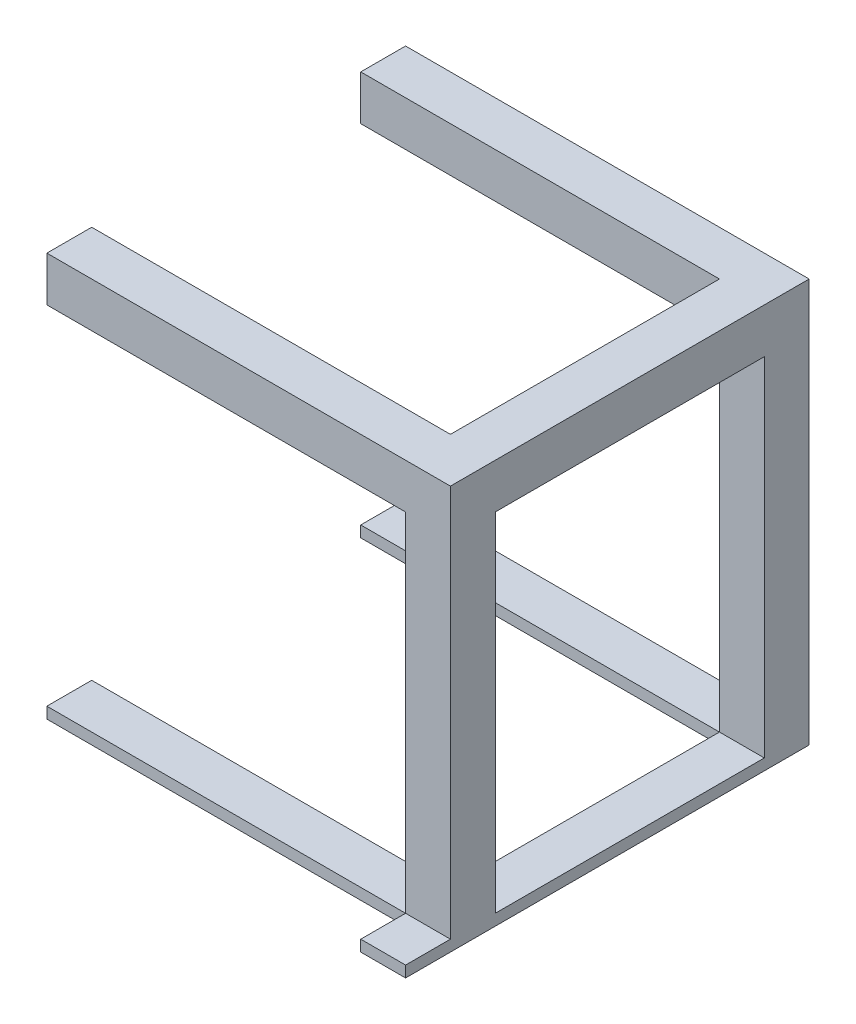
ISO-10303-21;
HEADER;
FILE_DESCRIPTION(('STEP AP214'),'2;1');
FILE_NAME('part.step','',(''),(''),'','','');
FILE_SCHEMA(('AUTOMOTIVE_DESIGN { 1 0 10303 214 1 1 1 1 }'));
ENDSEC;
DATA;
#1=APPLICATION_CONTEXT('core data for automotive mechanical design processes');
#2=APPLICATION_PROTOCOL_DEFINITION('international standard','automotive_design',2000,#1);
#3=PRODUCT_CONTEXT('',#1,'mechanical');
#4=PRODUCT('Part','Part','',(#3));
#5=PRODUCT_RELATED_PRODUCT_CATEGORY('part','',(#4));
#6=PRODUCT_DEFINITION_FORMATION('','',#4);
#7=PRODUCT_DEFINITION_CONTEXT('part definition',#1,'design');
#8=PRODUCT_DEFINITION('design','',#6,#7);
#9=PRODUCT_DEFINITION_SHAPE('','',#8);
#10=(LENGTH_UNIT() NAMED_UNIT(*) SI_UNIT(.MILLI.,.METRE.));
#11=(NAMED_UNIT(*) PLANE_ANGLE_UNIT() SI_UNIT($,.RADIAN.));
#12=(NAMED_UNIT(*) SI_UNIT($,.STERADIAN.) SOLID_ANGLE_UNIT());
#13=UNCERTAINTY_MEASURE_WITH_UNIT(LENGTH_MEASURE(1.E-05),#10,'distance_accuracy_value','');
#14=(GEOMETRIC_REPRESENTATION_CONTEXT(3) GLOBAL_UNCERTAINTY_ASSIGNED_CONTEXT((#13)) GLOBAL_UNIT_ASSIGNED_CONTEXT((#10,
#11,#12)) REPRESENTATION_CONTEXT('',''));
#15=CARTESIAN_POINT('',(0.,0.,0.));
#16=DIRECTION('',(0.,0.,1.));
#17=DIRECTION('',(1.,0.,0.));
#18=AXIS2_PLACEMENT_3D('',#15,#16,#17);
#19=CARTESIAN_POINT('',(627.350505616985,973.83218448899,1380.97382002432));
#20=DIRECTION('',(1.,0.,0.));
#21=DIRECTION('',(0.,1.,0.));
#22=AXIS2_PLACEMENT_3D('',#19,#20,#21);
#23=PLANE('',#22);
#24=DIRECTION('',(0.,0.,-1.));
#25=VECTOR('',#24,1.);
#26=CARTESIAN_POINT('',(627.350505616985,751.58218448899,1279.37382002432));
#27=LINE('',#26,#25);
#28=CARTESIAN_POINT('',(627.350505616985,751.58218448899,1380.97382002432));
#29=VERTEX_POINT('',#28);
#30=CARTESIAN_POINT('',(627.350505616985,751.58218448899,1355.57382002432));
#31=VERTEX_POINT('',#30);
#32=EDGE_CURVE('E46',#29,#31,#27,.T.);
#33=ORIENTED_EDGE('',*,*,#32,.T.);
#34=DIRECTION('',(0.,-1.,0.));
#35=VECTOR('',#34,1.);
#36=CARTESIAN_POINT('',(627.350505616985,751.58218448899,1355.57382002432));
#37=LINE('',#36,#35);
#38=CARTESIAN_POINT('',(627.350505616985,745.23218448899,1355.57382002432));
#39=VERTEX_POINT('',#38);
#40=EDGE_CURVE('E348',#31,#39,#37,.T.);
#41=ORIENTED_EDGE('',*,*,#40,.T.);
#42=DIRECTION('',(0.,0.,-1.));
#43=VECTOR('',#42,1.);
#44=CARTESIAN_POINT('',(627.350505616985,745.23218448899,1279.37382002432));
#45=LINE('',#44,#43);
#46=CARTESIAN_POINT('',(627.350505616985,745.23218448899,1380.97382002432));
#47=VERTEX_POINT('',#46);
#48=EDGE_CURVE('E346',#47,#39,#45,.T.);
#49=ORIENTED_EDGE('',*,*,#48,.F.);
#50=DIRECTION('',(0.,-1.,0.));
#51=VECTOR('',#50,1.);
#52=CARTESIAN_POINT('',(627.350505616985,751.58218448899,1380.97382002432));
#53=LINE('',#52,#51);
#54=EDGE_CURVE('E340',#29,#47,#53,.T.);
#55=ORIENTED_EDGE('',*,*,#54,.F.);
#56=EDGE_LOOP('',(#33,#41,#49,#55));
#57=FACE_BOUND('',#56,.T.);
#58=ADVANCED_FACE('F43',(#57),#23,.F.);
#59=DIRECTION('',(0.,-1.,0.));
#60=VECTOR('',#59,1.);
#61=CARTESIAN_POINT('',(627.350505616985,751.58218448899,1203.17382002432));
#62=LINE('',#61,#60);
#63=CARTESIAN_POINT('',(627.350505616985,751.58218448899,1203.17382002432));
#64=VERTEX_POINT('',#63);
#65=CARTESIAN_POINT('',(627.350505616985,745.23218448899,1203.17382002432));
#66=VERTEX_POINT('',#65);
#67=EDGE_CURVE('E335',#64,#66,#62,.T.);
#68=ORIENTED_EDGE('',*,*,#67,.F.);
#69=DIRECTION('',(0.,0.,-1.));
#70=VECTOR('',#69,1.);
#71=CARTESIAN_POINT('',(627.350505616985,751.58218448899,1279.37382002432));
#72=LINE('',#71,#70);
#73=CARTESIAN_POINT('',(627.350505616985,751.58218448899,1177.77382002432));
#74=VERTEX_POINT('',#73);
#75=EDGE_CURVE('E51',#64,#74,#72,.T.);
#76=ORIENTED_EDGE('',*,*,#75,.T.);
#77=DIRECTION('',(0.,-1.,0.));
#78=VECTOR('',#77,1.);
#79=CARTESIAN_POINT('',(627.350505616985,973.83218448899,1177.77382002432));
#80=LINE('',#79,#78);
#81=CARTESIAN_POINT('',(627.350505616985,745.23218448899,1177.77382002432));
#82=VERTEX_POINT('',#81);
#83=EDGE_CURVE('E336',#74,#82,#80,.T.);
#84=ORIENTED_EDGE('',*,*,#83,.T.);
#85=EDGE_CURVE('E345',#66,#82,#45,.T.);
#86=ORIENTED_EDGE('',*,*,#85,.F.);
#87=EDGE_LOOP('',(#68,#76,#84,#86));
#88=FACE_BOUND('',#87,.T.);
#89=ADVANCED_FACE('F434',(#88),#23,.F.);
#90=DIRECTION('',(0.,0.,-1.));
#91=VECTOR('',#90,1.);
#92=CARTESIAN_POINT('',(627.350505616985,973.83218448899,1279.37382002432));
#93=LINE('',#92,#91);
#94=CARTESIAN_POINT('',(627.350505616985,973.83218448899,1203.17382002432));
#95=VERTEX_POINT('',#94);
#96=CARTESIAN_POINT('',(627.350505616985,973.83218448899,1177.77382002432));
#97=VERTEX_POINT('',#96);
#98=EDGE_CURVE('E190',#95,#97,#93,.T.);
#99=ORIENTED_EDGE('',*,*,#98,.T.);
#100=CARTESIAN_POINT('',(627.350505616985,948.43218448899,1177.77382002432));
#101=VERTEX_POINT('',#100);
#102=EDGE_CURVE('E329',#97,#101,#80,.T.);
#103=ORIENTED_EDGE('',*,*,#102,.T.);
#104=DIRECTION('',(0.,0.,-1.));
#105=VECTOR('',#104,1.);
#106=CARTESIAN_POINT('',(627.350505616985,948.43218448899,1279.37382002432));
#107=LINE('',#106,#105);
#108=CARTESIAN_POINT('',(627.350505616985,948.43218448899,1203.17382002432));
#109=VERTEX_POINT('',#108);
#110=EDGE_CURVE('E327',#109,#101,#107,.T.);
#111=ORIENTED_EDGE('',*,*,#110,.F.);
#112=DIRECTION('',(0.,-1.,0.));
#113=VECTOR('',#112,1.);
#114=CARTESIAN_POINT('',(627.350505616985,973.83218448899,1203.17382002432));
#115=LINE('',#114,#113);
#116=EDGE_CURVE('E332',#95,#109,#115,.T.);
#117=ORIENTED_EDGE('',*,*,#116,.F.);
#118=EDGE_LOOP('',(#99,#103,#111,#117));
#119=FACE_BOUND('',#118,.T.);
#120=ADVANCED_FACE('F439',(#119),#23,.F.);
#121=DIRECTION('',(0.,1.,0.));
#122=VECTOR('',#121,1.);
#123=CARTESIAN_POINT('',(627.350505616985,973.83218448899,1380.97382002432));
#124=LINE('',#123,#122);
#125=CARTESIAN_POINT('',(627.350505616985,948.43218448899,1380.97382002432));
#126=VERTEX_POINT('',#125);
#127=CARTESIAN_POINT('',(627.350505616985,973.83218448899,1380.97382002432));
#128=VERTEX_POINT('',#127);
#129=EDGE_CURVE('E11',#126,#128,#124,.T.);
#130=ORIENTED_EDGE('',*,*,#129,.T.);
#131=CARTESIAN_POINT('',(627.350505616985,973.83218448899,1355.57382002432));
#132=VERTEX_POINT('',#131);
#133=EDGE_CURVE('E66',#128,#132,#93,.T.);
#134=ORIENTED_EDGE('',*,*,#133,.T.);
#135=DIRECTION('',(0.,1.,0.));
#136=VECTOR('',#135,1.);
#137=CARTESIAN_POINT('',(627.350505616985,973.83218448899,1355.57382002432));
#138=LINE('',#137,#136);
#139=CARTESIAN_POINT('',(627.350505616985,948.43218448899,1355.57382002432));
#140=VERTEX_POINT('',#139);
#141=EDGE_CURVE('E330',#140,#132,#138,.T.);
#142=ORIENTED_EDGE('',*,*,#141,.F.);
#143=DIRECTION('',(0.,0.,-1.));
#144=VECTOR('',#143,1.);
#145=CARTESIAN_POINT('',(627.350505616985,948.43218448899,1279.37382002432));
#146=LINE('',#145,#144);
#147=EDGE_CURVE('E58',#126,#140,#146,.T.);
#148=ORIENTED_EDGE('',*,*,#147,.F.);
#149=EDGE_LOOP('',(#130,#134,#142,#148));
#150=FACE_BOUND('',#149,.T.);
#151=ADVANCED_FACE('F435',(#150),#23,.F.);
#152=CARTESIAN_POINT('',(627.350505616985,948.43218448899,1279.37382002432));
#153=DIRECTION('',(0.,1.,0.));
#154=DIRECTION('',(0.,0.,1.));
#155=AXIS2_PLACEMENT_3D('',#152,#153,#154);
#156=PLANE('',#155);
#157=DIRECTION('',(1.,0.,0.));
#158=VECTOR('',#157,1.);
#159=CARTESIAN_POINT('',(627.350505616985,948.43218448899,1380.97382002432));
#160=LINE('',#159,#158);
#161=CARTESIAN_POINT('',(830.550505616985,948.43218448899,1380.97382002432));
#162=VERTEX_POINT('',#161);
#163=EDGE_CURVE('E222',#126,#162,#160,.T.);
#164=ORIENTED_EDGE('',*,*,#163,.F.);
#165=ORIENTED_EDGE('',*,*,#147,.T.);
#166=DIRECTION('',(1.,0.,0.));
#167=VECTOR('',#166,1.);
#168=CARTESIAN_POINT('',(627.350505616985,948.43218448899,1355.57382002432));
#169=LINE('',#168,#167);
#170=CARTESIAN_POINT('',(830.550505616985,948.43218448899,1355.57382002432));
#171=VERTEX_POINT('',#170);
#172=EDGE_CURVE('E219',#140,#171,#169,.T.);
#173=ORIENTED_EDGE('',*,*,#172,.T.);
#174=DIRECTION('',(0.,0.,1.));
#175=VECTOR('',#174,1.);
#176=CARTESIAN_POINT('',(830.550505616985,948.43218448899,1279.37382002432));
#177=LINE('',#176,#175);
#178=EDGE_CURVE('E216',#171,#162,#177,.T.);
#179=ORIENTED_EDGE('',*,*,#178,.T.);
#180=EDGE_LOOP('',(#164,#165,#173,#179));
#181=FACE_BOUND('',#180,.T.);
#182=ADVANCED_FACE('F442',(#181),#156,.F.);
#183=CARTESIAN_POINT('',(627.350505616985,973.83218448899,1380.97382002432));
#184=DIRECTION('',(0.,0.,-1.));
#185=DIRECTION('',(-1.,0.,0.));
#186=AXIS2_PLACEMENT_3D('',#183,#184,#185);
#187=PLANE('',#186);
#188=ORIENTED_EDGE('',*,*,#129,.F.);
#189=ORIENTED_EDGE('',*,*,#163,.T.);
#190=DIRECTION('',(0.,-1.,0.));
#191=VECTOR('',#190,1.);
#192=CARTESIAN_POINT('',(830.550505616985,973.83218448899,1380.97382002432));
#193=LINE('',#192,#191);
#194=CARTESIAN_POINT('',(830.550505616985,751.58218448899,1380.97382002432));
#195=VERTEX_POINT('',#194);
#196=EDGE_CURVE('E263',#162,#195,#193,.T.);
#197=ORIENTED_EDGE('',*,*,#196,.T.);
#198=DIRECTION('',(-1.,0.,0.));
#199=VECTOR('',#198,1.);
#200=CARTESIAN_POINT('',(627.350505616985,751.58218448899,1380.97382002432));
#201=LINE('',#200,#199);
#202=CARTESIAN_POINT('',(855.950505616985,751.58218448899,1380.97382002432));
#203=VERTEX_POINT('',#202);
#204=EDGE_CURVE('E269',#203,#195,#201,.T.);
#205=ORIENTED_EDGE('',*,*,#204,.F.);
#206=DIRECTION('',(0.,-1.,0.));
#207=VECTOR('',#206,1.);
#208=CARTESIAN_POINT('',(855.950505616985,973.83218448899,1380.97382002432));
#209=LINE('',#208,#207);
#210=CARTESIAN_POINT('',(855.950505616985,973.83218448899,1380.97382002432));
#211=VERTEX_POINT('',#210);
#212=EDGE_CURVE('E260',#211,#203,#209,.T.);
#213=ORIENTED_EDGE('',*,*,#212,.F.);
#214=DIRECTION('',(1.,0.,0.));
#215=VECTOR('',#214,1.);
#216=CARTESIAN_POINT('',(627.350505616985,973.83218448899,1380.97382002432));
#217=LINE('',#216,#215);
#218=EDGE_CURVE('E280',#128,#211,#217,.T.);
#219=ORIENTED_EDGE('',*,*,#218,.F.);
#220=EDGE_LOOP('',(#188,#189,#197,#205,#213,#219));
#221=FACE_BOUND('',#220,.T.);
#222=ADVANCED_FACE('F448',(#221),#187,.F.);
#223=CARTESIAN_POINT('',(627.350505616985,973.83218448899,1355.57382002432));
#224=DIRECTION('',(0.,0.,1.));
#225=DIRECTION('',(1.,0.,0.));
#226=AXIS2_PLACEMENT_3D('',#223,#224,#225);
#227=PLANE('',#226);
#228=DIRECTION('',(1.,0.,0.));
#229=VECTOR('',#228,1.);
#230=CARTESIAN_POINT('',(627.350505616985,948.43218448899,1355.57382002432));
#231=LINE('',#230,#229);
#232=CARTESIAN_POINT('',(855.950505616985,948.43218448899,1355.57382002432));
#233=VERTEX_POINT('',#232);
#234=EDGE_CURVE('E209',#171,#233,#231,.T.);
#235=ORIENTED_EDGE('',*,*,#234,.T.);
#236=DIRECTION('',(0.,-1.,0.));
#237=VECTOR('',#236,1.);
#238=CARTESIAN_POINT('',(855.950505616985,973.83218448899,1355.57382002432));
#239=LINE('',#238,#237);
#240=CARTESIAN_POINT('',(855.950505616985,751.58218448899,1355.57382002432));
#241=VERTEX_POINT('',#240);
#242=EDGE_CURVE('E258',#233,#241,#239,.T.);
#243=ORIENTED_EDGE('',*,*,#242,.T.);
#244=DIRECTION('',(-1.,0.,0.));
#245=VECTOR('',#244,1.);
#246=CARTESIAN_POINT('',(627.350505616985,751.58218448899,1355.57382002432));
#247=LINE('',#246,#245);
#248=CARTESIAN_POINT('',(830.550505616985,751.58218448899,1355.57382002432));
#249=VERTEX_POINT('',#248);
#250=EDGE_CURVE('E275',#241,#249,#247,.T.);
#251=ORIENTED_EDGE('',*,*,#250,.T.);
#252=DIRECTION('',(0.,-1.,0.));
#253=VECTOR('',#252,1.);
#254=CARTESIAN_POINT('',(830.550505616985,973.83218448899,1355.57382002432));
#255=LINE('',#254,#253);
#256=EDGE_CURVE('E266',#171,#249,#255,.T.);
#257=ORIENTED_EDGE('',*,*,#256,.F.);
#258=EDGE_LOOP('',(#235,#243,#251,#257));
#259=FACE_BOUND('',#258,.T.);
#260=ADVANCED_FACE('F392',(#259),#227,.F.);
#261=CARTESIAN_POINT('',(627.350505616985,973.83218448899,1203.17382002432));
#262=DIRECTION('',(0.,0.,-1.));
#263=DIRECTION('',(-1.,0.,0.));
#264=AXIS2_PLACEMENT_3D('',#261,#262,#263);
#265=PLANE('',#264);
#266=DIRECTION('',(1.,0.,0.));
#267=VECTOR('',#266,1.);
#268=CARTESIAN_POINT('',(627.350505616985,948.43218448899,1203.17382002432));
#269=LINE('',#268,#267);
#270=CARTESIAN_POINT('',(830.550505616985,948.43218448899,1203.17382002432));
#271=VERTEX_POINT('',#270);
#272=CARTESIAN_POINT('',(855.950505616985,948.43218448899,1203.17382002432));
#273=VERTEX_POINT('',#272);
#274=EDGE_CURVE('E406',#271,#273,#269,.T.);
#275=ORIENTED_EDGE('',*,*,#274,.F.);
#276=DIRECTION('',(0.,-1.,0.));
#277=VECTOR('',#276,1.);
#278=CARTESIAN_POINT('',(830.550505616985,973.83218448899,1203.17382002432));
#279=LINE('',#278,#277);
#280=CARTESIAN_POINT('',(830.550505616985,751.58218448899,1203.17382002432));
#281=VERTEX_POINT('',#280);
#282=EDGE_CURVE('E249',#271,#281,#279,.T.);
#283=ORIENTED_EDGE('',*,*,#282,.T.);
#284=DIRECTION('',(1.,0.,0.));
#285=VECTOR('',#284,1.);
#286=CARTESIAN_POINT('',(627.350505616985,751.58218448899,1203.17382002432));
#287=LINE('',#286,#285);
#288=CARTESIAN_POINT('',(855.950505616985,751.58218448899,1203.17382002432));
#289=VERTEX_POINT('',#288);
#290=EDGE_CURVE('E295',#281,#289,#287,.T.);
#291=ORIENTED_EDGE('',*,*,#290,.T.);
#292=DIRECTION('',(0.,-1.,0.));
#293=VECTOR('',#292,1.);
#294=CARTESIAN_POINT('',(855.950505616985,973.83218448899,1203.17382002432));
#295=LINE('',#294,#293);
#296=EDGE_CURVE('E247',#273,#289,#295,.T.);
#297=ORIENTED_EDGE('',*,*,#296,.F.);
#298=EDGE_LOOP('',(#275,#283,#291,#297));
#299=FACE_BOUND('',#298,.T.);
#300=ADVANCED_FACE('F404',(#299),#265,.F.);
#301=ORIENTED_EDGE('',*,*,#172,.F.);
#302=ORIENTED_EDGE('',*,*,#141,.T.);
#303=DIRECTION('',(-1.,0.,0.));
#304=VECTOR('',#303,1.);
#305=CARTESIAN_POINT('',(627.350505616985,973.83218448899,1355.57382002432));
#306=LINE('',#305,#304);
#307=CARTESIAN_POINT('',(830.550505616985,973.83218448899,1355.57382002432));
#308=VERTEX_POINT('',#307);
#309=EDGE_CURVE('E278',#308,#132,#306,.T.);
#310=ORIENTED_EDGE('',*,*,#309,.F.);
#311=DIRECTION('',(0.,-1.,0.));
#312=VECTOR('',#311,1.);
#313=CARTESIAN_POINT('',(830.550505616985,973.83218448899,1355.57382002432));
#314=LINE('',#313,#312);
#315=EDGE_CURVE('E203',#308,#171,#314,.T.);
#316=ORIENTED_EDGE('',*,*,#315,.T.);
#317=EDGE_LOOP('',(#301,#302,#310,#316));
#318=FACE_BOUND('',#317,.T.);
#319=ADVANCED_FACE('F471',(#318),#227,.F.);
#320=DIRECTION('',(1.,0.,0.));
#321=VECTOR('',#320,1.);
#322=CARTESIAN_POINT('',(627.350505616985,973.83218448899,1203.17382002432));
#323=LINE('',#322,#321);
#324=CARTESIAN_POINT('',(830.550505616985,973.83218448899,1203.17382002432));
#325=VERTEX_POINT('',#324);
#326=EDGE_CURVE('E183',#95,#325,#323,.T.);
#327=ORIENTED_EDGE('',*,*,#326,.F.);
#328=ORIENTED_EDGE('',*,*,#116,.T.);
#329=DIRECTION('',(1.,0.,0.));
#330=VECTOR('',#329,1.);
#331=CARTESIAN_POINT('',(627.350505616985,948.43218448899,1203.17382002432));
#332=LINE('',#331,#330);
#333=EDGE_CURVE('E208',#109,#271,#332,.T.);
#334=ORIENTED_EDGE('',*,*,#333,.T.);
#335=DIRECTION('',(0.,-1.,0.));
#336=VECTOR('',#335,1.);
#337=CARTESIAN_POINT('',(830.550505616985,973.83218448899,1203.17382002432));
#338=LINE('',#337,#336);
#339=EDGE_CURVE('E200',#325,#271,#338,.T.);
#340=ORIENTED_EDGE('',*,*,#339,.F.);
#341=EDGE_LOOP('',(#327,#328,#334,#340));
#342=FACE_BOUND('',#341,.T.);
#343=ADVANCED_FACE('F206',(#342),#265,.F.);
#344=CARTESIAN_POINT('',(830.550505616985,973.83218448899,1279.37382002432));
#345=DIRECTION('',(1.,0.,0.));
#346=DIRECTION('',(0.,0.,-1.));
#347=AXIS2_PLACEMENT_3D('',#344,#345,#346);
#348=PLANE('',#347);
#349=ORIENTED_EDGE('',*,*,#178,.F.);
#350=ORIENTED_EDGE('',*,*,#256,.T.);
#351=DIRECTION('',(0.,0.,-1.));
#352=VECTOR('',#351,1.);
#353=CARTESIAN_POINT('',(830.550505616985,751.58218448899,1279.37382002432));
#354=LINE('',#353,#352);
#355=EDGE_CURVE('E272',#195,#249,#354,.T.);
#356=ORIENTED_EDGE('',*,*,#355,.F.);
#357=ORIENTED_EDGE('',*,*,#196,.F.);
#358=EDGE_LOOP('',(#349,#350,#356,#357));
#359=FACE_BOUND('',#358,.T.);
#360=ADVANCED_FACE('F374',(#359),#348,.F.);
#361=CARTESIAN_POINT('',(830.550505616985,751.58218448899,1279.37382002432));
#362=DIRECTION('',(-1.,0.,0.));
#363=DIRECTION('',(0.,0.,1.));
#364=AXIS2_PLACEMENT_3D('',#361,#362,#363);
#365=PLANE('',#364);
#366=ORIENTED_EDGE('',*,*,#282,.F.);
#367=DIRECTION('',(0.,0.,1.));
#368=VECTOR('',#367,1.);
#369=CARTESIAN_POINT('',(830.550505616985,948.43218448899,1279.37382002432));
#370=LINE('',#369,#368);
#371=CARTESIAN_POINT('',(830.550505616985,948.43218448899,1177.77382002432));
#372=VERTEX_POINT('',#371);
#373=EDGE_CURVE('E224',#372,#271,#370,.T.);
#374=ORIENTED_EDGE('',*,*,#373,.F.);
#375=DIRECTION('',(0.,-1.,0.));
#376=VECTOR('',#375,1.);
#377=CARTESIAN_POINT('',(830.550505616985,973.83218448899,1177.77382002432));
#378=LINE('',#377,#376);
#379=CARTESIAN_POINT('',(830.550505616985,751.58218448899,1177.77382002432));
#380=VERTEX_POINT('',#379);
#381=EDGE_CURVE('E252',#372,#380,#378,.T.);
#382=ORIENTED_EDGE('',*,*,#381,.T.);
#383=DIRECTION('',(0.,0.,1.));
#384=VECTOR('',#383,1.);
#385=CARTESIAN_POINT('',(830.550505616985,751.58218448899,1279.37382002432));
#386=LINE('',#385,#384);
#387=EDGE_CURVE('E231',#380,#281,#386,.T.);
#388=ORIENTED_EDGE('',*,*,#387,.T.);
#389=EDGE_LOOP('',(#366,#374,#382,#388));
#390=FACE_BOUND('',#389,.T.);
#391=ADVANCED_FACE('F410',(#390),#365,.T.);
#392=DIRECTION('',(0.,0.,-1.));
#393=VECTOR('',#392,1.);
#394=CARTESIAN_POINT('',(830.550505616985,751.58218448899,1279.37382002432));
#395=LINE('',#394,#393);
#396=EDGE_CURVE('E298',#249,#281,#395,.T.);
#397=ORIENTED_EDGE('',*,*,#396,.T.);
#398=DIRECTION('',(0.,-1.,0.));
#399=VECTOR('',#398,1.);
#400=CARTESIAN_POINT('',(830.550505616985,751.58218448899,1203.17382002432));
#401=LINE('',#400,#399);
#402=CARTESIAN_POINT('',(830.550505616985,745.23218448899,1203.17382002432));
#403=VERTEX_POINT('',#402);
#404=EDGE_CURVE('E238',#281,#403,#401,.T.);
#405=ORIENTED_EDGE('',*,*,#404,.T.);
#406=DIRECTION('',(0.,0.,-1.));
#407=VECTOR('',#406,1.);
#408=CARTESIAN_POINT('',(830.550505616985,745.23218448899,1279.37382002432));
#409=LINE('',#408,#407);
#410=CARTESIAN_POINT('',(830.550505616985,745.23218448899,1355.57382002432));
#411=VERTEX_POINT('',#410);
#412=EDGE_CURVE('E314',#411,#403,#409,.T.);
#413=ORIENTED_EDGE('',*,*,#412,.F.);
#414=DIRECTION('',(0.,-1.,0.));
#415=VECTOR('',#414,1.);
#416=CARTESIAN_POINT('',(830.550505616985,751.58218448899,1355.57382002432));
#417=LINE('',#416,#415);
#418=EDGE_CURVE('E303',#249,#411,#417,.T.);
#419=ORIENTED_EDGE('',*,*,#418,.F.);
#420=EDGE_LOOP('',(#397,#405,#413,#419));
#421=FACE_BOUND('',#420,.T.);
#422=ADVANCED_FACE('F383',(#421),#365,.T.);
#423=CARTESIAN_POINT('',(627.350505616985,751.58218448899,1279.37382002432));
#424=DIRECTION('',(0.,1.,0.));
#425=DIRECTION('',(0.,0.,1.));
#426=AXIS2_PLACEMENT_3D('',#423,#424,#425);
#427=PLANE('',#426);
#428=ORIENTED_EDGE('',*,*,#32,.F.);
#429=DIRECTION('',(1.,0.,0.));
#430=VECTOR('',#429,1.);
#431=CARTESIAN_POINT('',(627.350505616985,751.58218448899,1380.97382002432));
#432=LINE('',#431,#430);
#433=EDGE_CURVE('E283',#29,#195,#432,.T.);
#434=ORIENTED_EDGE('',*,*,#433,.T.);
#435=ORIENTED_EDGE('',*,*,#355,.T.);
#436=DIRECTION('',(1.,0.,0.));
#437=VECTOR('',#436,1.);
#438=CARTESIAN_POINT('',(627.350505616985,751.58218448899,1355.57382002432));
#439=LINE('',#438,#437);
#440=EDGE_CURVE('E301',#31,#249,#439,.T.);
#441=ORIENTED_EDGE('',*,*,#440,.F.);
#442=EDGE_LOOP('',(#428,#434,#435,#441));
#443=FACE_BOUND('',#442,.T.);
#444=ADVANCED_FACE('F379',(#443),#427,.T.);
#445=DIRECTION('',(0.,0.,-1.));
#446=VECTOR('',#445,1.);
#447=CARTESIAN_POINT('',(855.950505616985,751.58218448899,1279.37382002432));
#448=LINE('',#447,#446);
#449=CARTESIAN_POINT('',(855.950505616985,751.58218448899,1406.37382002432));
#450=VERTEX_POINT('',#449);
#451=EDGE_CURVE('E293',#450,#203,#448,.T.);
#452=ORIENTED_EDGE('',*,*,#451,.T.);
#453=ORIENTED_EDGE('',*,*,#204,.T.);
#454=DIRECTION('',(0.,0.,-1.));
#455=VECTOR('',#454,1.);
#456=CARTESIAN_POINT('',(830.550505616985,751.58218448899,1279.37382002432));
#457=LINE('',#456,#455);
#458=CARTESIAN_POINT('',(830.550505616985,751.58218448899,1406.37382002432));
#459=VERTEX_POINT('',#458);
#460=EDGE_CURVE('E285',#459,#195,#457,.T.);
#461=ORIENTED_EDGE('',*,*,#460,.F.);
#462=DIRECTION('',(-1.,0.,0.));
#463=VECTOR('',#462,1.);
#464=CARTESIAN_POINT('',(627.350505616985,751.58218448899,1406.37382002432));
#465=LINE('',#464,#463);
#466=EDGE_CURVE('E289',#450,#459,#465,.T.);
#467=ORIENTED_EDGE('',*,*,#466,.F.);
#468=EDGE_LOOP('',(#452,#453,#461,#467));
#469=FACE_BOUND('',#468,.T.);
#470=ADVANCED_FACE('F428',(#469),#427,.T.);
#471=CARTESIAN_POINT('',(627.350505616985,751.58218448899,1380.97382002432));
#472=DIRECTION('',(0.,0.,-1.));
#473=DIRECTION('',(-1.,0.,0.));
#474=AXIS2_PLACEMENT_3D('',#471,#472,#473);
#475=PLANE('',#474);
#476=ORIENTED_EDGE('',*,*,#433,.F.);
#477=ORIENTED_EDGE('',*,*,#54,.T.);
#478=DIRECTION('',(1.,0.,0.));
#479=VECTOR('',#478,1.);
#480=CARTESIAN_POINT('',(627.350505616985,745.23218448899,1380.97382002432));
#481=LINE('',#480,#479);
#482=CARTESIAN_POINT('',(830.550505616985,745.23218448899,1380.97382002432));
#483=VERTEX_POINT('',#482);
#484=EDGE_CURVE('E282',#47,#483,#481,.T.);
#485=ORIENTED_EDGE('',*,*,#484,.T.);
#486=DIRECTION('',(0.,-1.,0.));
#487=VECTOR('',#486,1.);
#488=CARTESIAN_POINT('',(830.550505616985,751.58218448899,1380.97382002432));
#489=LINE('',#488,#487);
#490=EDGE_CURVE('E324',#195,#483,#489,.T.);
#491=ORIENTED_EDGE('',*,*,#490,.F.);
#492=EDGE_LOOP('',(#476,#477,#485,#491));
#493=FACE_BOUND('',#492,.T.);
#494=ADVANCED_FACE('F353',(#493),#475,.F.);
#495=CARTESIAN_POINT('',(830.550505616985,751.58218448899,1279.37382002432));
#496=DIRECTION('',(-1.,0.,0.));
#497=DIRECTION('',(0.,0.,1.));
#498=AXIS2_PLACEMENT_3D('',#495,#496,#497);
#499=PLANE('',#498);
#500=DIRECTION('',(0.,0.,-1.));
#501=VECTOR('',#500,1.);
#502=CARTESIAN_POINT('',(830.550505616985,745.23218448899,1279.37382002432));
#503=LINE('',#502,#501);
#504=CARTESIAN_POINT('',(830.550505616985,745.23218448899,1406.37382002432));
#505=VERTEX_POINT('',#504);
#506=EDGE_CURVE('E305',#505,#483,#503,.T.);
#507=ORIENTED_EDGE('',*,*,#506,.F.);
#508=DIRECTION('',(0.,-1.,0.));
#509=VECTOR('',#508,1.);
#510=CARTESIAN_POINT('',(830.550505616985,751.58218448899,1406.37382002432));
#511=LINE('',#510,#509);
#512=EDGE_CURVE('E322',#459,#505,#511,.T.);
#513=ORIENTED_EDGE('',*,*,#512,.F.);
#514=ORIENTED_EDGE('',*,*,#460,.T.);
#515=ORIENTED_EDGE('',*,*,#490,.T.);
#516=EDGE_LOOP('',(#507,#513,#514,#515));
#517=FACE_BOUND('',#516,.T.);
#518=ADVANCED_FACE('F366',(#517),#499,.T.);
#519=CARTESIAN_POINT('',(627.350505616985,751.58218448899,1406.37382002432));
#520=DIRECTION('',(0.,0.,1.));
#521=DIRECTION('',(1.,0.,0.));
#522=AXIS2_PLACEMENT_3D('',#519,#520,#521);
#523=PLANE('',#522);
#524=DIRECTION('',(-1.,0.,0.));
#525=VECTOR('',#524,1.);
#526=CARTESIAN_POINT('',(627.350505616985,745.23218448899,1406.37382002432));
#527=LINE('',#526,#525);
#528=CARTESIAN_POINT('',(855.950505616985,745.23218448899,1406.37382002432));
#529=VERTEX_POINT('',#528);
#530=EDGE_CURVE('E308',#529,#505,#527,.T.);
#531=ORIENTED_EDGE('',*,*,#530,.F.);
#532=DIRECTION('',(0.,-1.,0.));
#533=VECTOR('',#532,1.);
#534=CARTESIAN_POINT('',(855.950505616985,751.58218448899,1406.37382002432));
#535=LINE('',#534,#533);
#536=EDGE_CURVE('E320',#450,#529,#535,.T.);
#537=ORIENTED_EDGE('',*,*,#536,.F.);
#538=ORIENTED_EDGE('',*,*,#466,.T.);
#539=ORIENTED_EDGE('',*,*,#512,.T.);
#540=EDGE_LOOP('',(#531,#537,#538,#539));
#541=FACE_BOUND('',#540,.T.);
#542=ADVANCED_FACE('F429',(#541),#523,.T.);
#543=CARTESIAN_POINT('',(855.950505616985,751.58218448899,1279.37382002432));
#544=DIRECTION('',(-1.,0.,0.));
#545=DIRECTION('',(0.,0.,1.));
#546=AXIS2_PLACEMENT_3D('',#543,#544,#545);
#547=PLANE('',#546);
#548=DIRECTION('',(0.,0.,-1.));
#549=VECTOR('',#548,1.);
#550=CARTESIAN_POINT('',(855.950505616985,948.43218448899,1279.37382002432));
#551=LINE('',#550,#549);
#552=EDGE_CURVE('E400',#233,#273,#551,.T.);
#553=ORIENTED_EDGE('',*,*,#552,.T.);
#554=ORIENTED_EDGE('',*,*,#296,.T.);
#555=EDGE_CURVE('E292',#241,#289,#448,.T.);
#556=ORIENTED_EDGE('',*,*,#555,.F.);
#557=ORIENTED_EDGE('',*,*,#242,.F.);
#558=EDGE_LOOP('',(#553,#554,#556,#557));
#559=FACE_BOUND('',#558,.T.);
#560=DIRECTION('',(0.,-1.,0.));
#561=VECTOR('',#560,1.);
#562=CARTESIAN_POINT('',(855.950505616985,973.83218448899,1177.77382002432));
#563=LINE('',#562,#561);
#564=CARTESIAN_POINT('',(855.950505616985,973.83218448899,1177.77382002432));
#565=VERTEX_POINT('',#564);
#566=CARTESIAN_POINT('',(855.950505616985,745.23218448899,1177.77382002432));
#567=VERTEX_POINT('',#566);
#568=EDGE_CURVE('E193',#565,#567,#563,.T.);
#569=ORIENTED_EDGE('',*,*,#568,.F.);
#570=DIRECTION('',(0.,0.,-1.));
#571=VECTOR('',#570,1.);
#572=CARTESIAN_POINT('',(855.950505616985,973.83218448899,1279.37382002432));
#573=LINE('',#572,#571);
#574=EDGE_CURVE('E255',#211,#565,#573,.T.);
#575=ORIENTED_EDGE('',*,*,#574,.F.);
#576=ORIENTED_EDGE('',*,*,#212,.T.);
#577=ORIENTED_EDGE('',*,*,#451,.F.);
#578=ORIENTED_EDGE('',*,*,#536,.T.);
#579=DIRECTION('',(0.,0.,-1.));
#580=VECTOR('',#579,1.);
#581=CARTESIAN_POINT('',(855.950505616985,745.23218448899,1279.37382002432));
#582=LINE('',#581,#580);
#583=EDGE_CURVE('E311',#529,#567,#582,.T.);
#584=ORIENTED_EDGE('',*,*,#583,.T.);
#585=EDGE_LOOP('',(#569,#575,#576,#577,#578,#584));
#586=FACE_BOUND('',#585,.T.);
#587=ADVANCED_FACE('F397',(#559,#586),#547,.F.);
#588=CARTESIAN_POINT('',(627.350505616985,751.58218448899,1355.57382002432));
#589=DIRECTION('',(0.,0.,-1.));
#590=DIRECTION('',(-1.,0.,0.));
#591=AXIS2_PLACEMENT_3D('',#588,#589,#590);
#592=PLANE('',#591);
#593=ORIENTED_EDGE('',*,*,#40,.F.);
#594=ORIENTED_EDGE('',*,*,#440,.T.);
#595=ORIENTED_EDGE('',*,*,#418,.T.);
#596=DIRECTION('',(1.,0.,0.));
#597=VECTOR('',#596,1.);
#598=CARTESIAN_POINT('',(627.350505616985,745.23218448899,1355.57382002432));
#599=LINE('',#598,#597);
#600=EDGE_CURVE('E286',#39,#411,#599,.T.);
#601=ORIENTED_EDGE('',*,*,#600,.F.);
#602=EDGE_LOOP('',(#593,#594,#595,#601));
#603=FACE_BOUND('',#602,.T.);
#604=ADVANCED_FACE('F420',(#603),#592,.T.);
#605=ORIENTED_EDGE('',*,*,#250,.F.);
#606=ORIENTED_EDGE('',*,*,#555,.T.);
#607=ORIENTED_EDGE('',*,*,#290,.F.);
#608=ORIENTED_EDGE('',*,*,#396,.F.);
#609=EDGE_LOOP('',(#605,#606,#607,#608));
#610=FACE_BOUND('',#609,.T.);
#611=ADVANCED_FACE('F389',(#610),#427,.T.);
#612=CARTESIAN_POINT('',(627.350505616985,745.23218448899,1279.37382002432));
#613=DIRECTION('',(0.,1.,0.));
#614=DIRECTION('',(0.,0.,1.));
#615=AXIS2_PLACEMENT_3D('',#612,#613,#614);
#616=PLANE('',#615);
#617=ORIENTED_EDGE('',*,*,#484,.F.);
#618=ORIENTED_EDGE('',*,*,#48,.T.);
#619=ORIENTED_EDGE('',*,*,#600,.T.);
#620=ORIENTED_EDGE('',*,*,#412,.T.);
#621=DIRECTION('',(1.,0.,0.));
#622=VECTOR('',#621,1.);
#623=CARTESIAN_POINT('',(627.350505616985,745.23218448899,1203.17382002432));
#624=LINE('',#623,#622);
#625=EDGE_CURVE('E230',#66,#403,#624,.T.);
#626=ORIENTED_EDGE('',*,*,#625,.F.);
#627=ORIENTED_EDGE('',*,*,#85,.T.);
#628=DIRECTION('',(1.,0.,0.));
#629=VECTOR('',#628,1.);
#630=CARTESIAN_POINT('',(627.350505616985,745.23218448899,1177.77382002432));
#631=LINE('',#630,#629);
#632=EDGE_CURVE('E242',#82,#567,#631,.T.);
#633=ORIENTED_EDGE('',*,*,#632,.T.);
#634=ORIENTED_EDGE('',*,*,#583,.F.);
#635=ORIENTED_EDGE('',*,*,#530,.T.);
#636=ORIENTED_EDGE('',*,*,#506,.T.);
#637=EDGE_LOOP('',(#617,#618,#619,#620,#626,#627,#633,#634,#635,#636));
#638=FACE_BOUND('',#637,.T.);
#639=ADVANCED_FACE('F361',(#638),#616,.F.);
#640=CARTESIAN_POINT('',(627.350505616985,973.83218448899,1279.37382002432));
#641=DIRECTION('',(0.,1.,0.));
#642=DIRECTION('',(0.,0.,1.));
#643=AXIS2_PLACEMENT_3D('',#640,#641,#642);
#644=PLANE('',#643);
#645=ORIENTED_EDGE('',*,*,#133,.F.);
#646=ORIENTED_EDGE('',*,*,#218,.T.);
#647=ORIENTED_EDGE('',*,*,#574,.T.);
#648=DIRECTION('',(1.,0.,0.));
#649=VECTOR('',#648,1.);
#650=CARTESIAN_POINT('',(627.350505616985,973.83218448899,1177.77382002432));
#651=LINE('',#650,#649);
#652=EDGE_CURVE('E194',#97,#565,#651,.T.);
#653=ORIENTED_EDGE('',*,*,#652,.F.);
#654=ORIENTED_EDGE('',*,*,#98,.F.);
#655=ORIENTED_EDGE('',*,*,#326,.T.);
#656=DIRECTION('',(0.,0.,-1.));
#657=VECTOR('',#656,1.);
#658=CARTESIAN_POINT('',(830.550505616985,973.83218448899,1279.37382002432));
#659=LINE('',#658,#657);
#660=EDGE_CURVE('E186',#308,#325,#659,.T.);
#661=ORIENTED_EDGE('',*,*,#660,.F.);
#662=ORIENTED_EDGE('',*,*,#309,.T.);
#663=EDGE_LOOP('',(#645,#646,#647,#653,#654,#655,#661,#662));
#664=FACE_BOUND('',#663,.T.);
#665=ADVANCED_FACE('F185',(#664),#644,.T.);
#666=CARTESIAN_POINT('',(627.350505616985,973.83218448899,1177.77382002432));
#667=DIRECTION('',(0.,0.,-1.));
#668=DIRECTION('',(-1.,0.,0.));
#669=AXIS2_PLACEMENT_3D('',#666,#667,#668);
#670=PLANE('',#669);
#671=ORIENTED_EDGE('',*,*,#102,.F.);
#672=ORIENTED_EDGE('',*,*,#652,.T.);
#673=ORIENTED_EDGE('',*,*,#568,.T.);
#674=ORIENTED_EDGE('',*,*,#632,.F.);
#675=ORIENTED_EDGE('',*,*,#83,.F.);
#676=DIRECTION('',(1.,0.,0.));
#677=VECTOR('',#676,1.);
#678=CARTESIAN_POINT('',(627.350505616985,751.58218448899,1177.77382002432));
#679=LINE('',#678,#677);
#680=EDGE_CURVE('E234',#74,#380,#679,.T.);
#681=ORIENTED_EDGE('',*,*,#680,.T.);
#682=ORIENTED_EDGE('',*,*,#381,.F.);
#683=DIRECTION('',(1.,0.,0.));
#684=VECTOR('',#683,1.);
#685=CARTESIAN_POINT('',(627.350505616985,948.43218448899,1177.77382002432));
#686=LINE('',#685,#684);
#687=EDGE_CURVE('E227',#101,#372,#686,.T.);
#688=ORIENTED_EDGE('',*,*,#687,.F.);
#689=EDGE_LOOP('',(#671,#672,#673,#674,#675,#681,#682,#688));
#690=FACE_BOUND('',#689,.T.);
#691=ADVANCED_FACE('F468',(#690),#670,.T.);
#692=CARTESIAN_POINT('',(627.350505616985,751.58218448899,1203.17382002432));
#693=DIRECTION('',(0.,0.,-1.));
#694=DIRECTION('',(-1.,0.,0.));
#695=AXIS2_PLACEMENT_3D('',#692,#693,#694);
#696=PLANE('',#695);
#697=DIRECTION('',(1.,0.,0.));
#698=VECTOR('',#697,1.);
#699=CARTESIAN_POINT('',(627.350505616985,751.58218448899,1203.17382002432));
#700=LINE('',#699,#698);
#701=EDGE_CURVE('E236',#64,#281,#700,.T.);
#702=ORIENTED_EDGE('',*,*,#701,.F.);
#703=ORIENTED_EDGE('',*,*,#67,.T.);
#704=ORIENTED_EDGE('',*,*,#625,.T.);
#705=ORIENTED_EDGE('',*,*,#404,.F.);
#706=EDGE_LOOP('',(#702,#703,#704,#705));
#707=FACE_BOUND('',#706,.T.);
#708=ADVANCED_FACE('F418',(#707),#696,.F.);
#709=CARTESIAN_POINT('',(627.350505616985,751.58218448899,1279.37382002432));
#710=DIRECTION('',(0.,1.,0.));
#711=DIRECTION('',(0.,0.,1.));
#712=AXIS2_PLACEMENT_3D('',#709,#710,#711);
#713=PLANE('',#712);
#714=ORIENTED_EDGE('',*,*,#75,.F.);
#715=ORIENTED_EDGE('',*,*,#701,.T.);
#716=ORIENTED_EDGE('',*,*,#387,.F.);
#717=ORIENTED_EDGE('',*,*,#680,.F.);
#718=EDGE_LOOP('',(#714,#715,#716,#717));
#719=FACE_BOUND('',#718,.T.);
#720=ADVANCED_FACE('F414',(#719),#713,.T.);
#721=CARTESIAN_POINT('',(627.350505616985,948.43218448899,1279.37382002432));
#722=DIRECTION('',(0.,1.,0.));
#723=DIRECTION('',(0.,0.,1.));
#724=AXIS2_PLACEMENT_3D('',#721,#722,#723);
#725=PLANE('',#724);
#726=ORIENTED_EDGE('',*,*,#333,.F.);
#727=ORIENTED_EDGE('',*,*,#110,.T.);
#728=ORIENTED_EDGE('',*,*,#687,.T.);
#729=ORIENTED_EDGE('',*,*,#373,.T.);
#730=EDGE_LOOP('',(#726,#727,#728,#729));
#731=FACE_BOUND('',#730,.T.);
#732=ADVANCED_FACE('F458',(#731),#725,.F.);
#733=CARTESIAN_POINT('',(830.550505616985,973.83218448899,1279.37382002432));
#734=DIRECTION('',(-1.,0.,0.));
#735=DIRECTION('',(0.,0.,1.));
#736=AXIS2_PLACEMENT_3D('',#733,#734,#735);
#737=PLANE('',#736);
#738=DIRECTION('',(0.,0.,-1.));
#739=VECTOR('',#738,1.);
#740=CARTESIAN_POINT('',(830.550505616985,948.43218448899,1279.37382002432));
#741=LINE('',#740,#739);
#742=EDGE_CURVE('E220',#171,#271,#741,.T.);
#743=ORIENTED_EDGE('',*,*,#742,.F.);
#744=ORIENTED_EDGE('',*,*,#315,.F.);
#745=ORIENTED_EDGE('',*,*,#660,.T.);
#746=ORIENTED_EDGE('',*,*,#339,.T.);
#747=EDGE_LOOP('',(#743,#744,#745,#746));
#748=FACE_BOUND('',#747,.T.);
#749=ADVANCED_FACE('F199',(#748),#737,.T.);
#750=CARTESIAN_POINT('',(627.350505616985,948.43218448899,1279.37382002432));
#751=DIRECTION('',(0.,1.,0.));
#752=DIRECTION('',(0.,0.,1.));
#753=AXIS2_PLACEMENT_3D('',#750,#751,#752);
#754=PLANE('',#753);
#755=ORIENTED_EDGE('',*,*,#274,.T.);
#756=ORIENTED_EDGE('',*,*,#552,.F.);
#757=ORIENTED_EDGE('',*,*,#234,.F.);
#758=ORIENTED_EDGE('',*,*,#742,.T.);
#759=EDGE_LOOP('',(#755,#756,#757,#758));
#760=FACE_BOUND('',#759,.T.);
#761=ADVANCED_FACE('F443',(#760),#754,.F.);
#762=CLOSED_SHELL('',(#58,#89,#120,#151,#182,#222,#260,#300,#319,#343,#360,#391,#422,#444,#470,
#494,#518,#542,#587,#604,#611,#639,#665,#691,#708,#720,#732,#749,#761));
#763=MANIFOLD_SOLID_BREP('B2',#762);
#764=ADVANCED_BREP_SHAPE_REPRESENTATION('',(#18,#763),#14);
#765=SHAPE_DEFINITION_REPRESENTATION(#9,#764);
ENDSEC;
END-ISO-10303-21;
